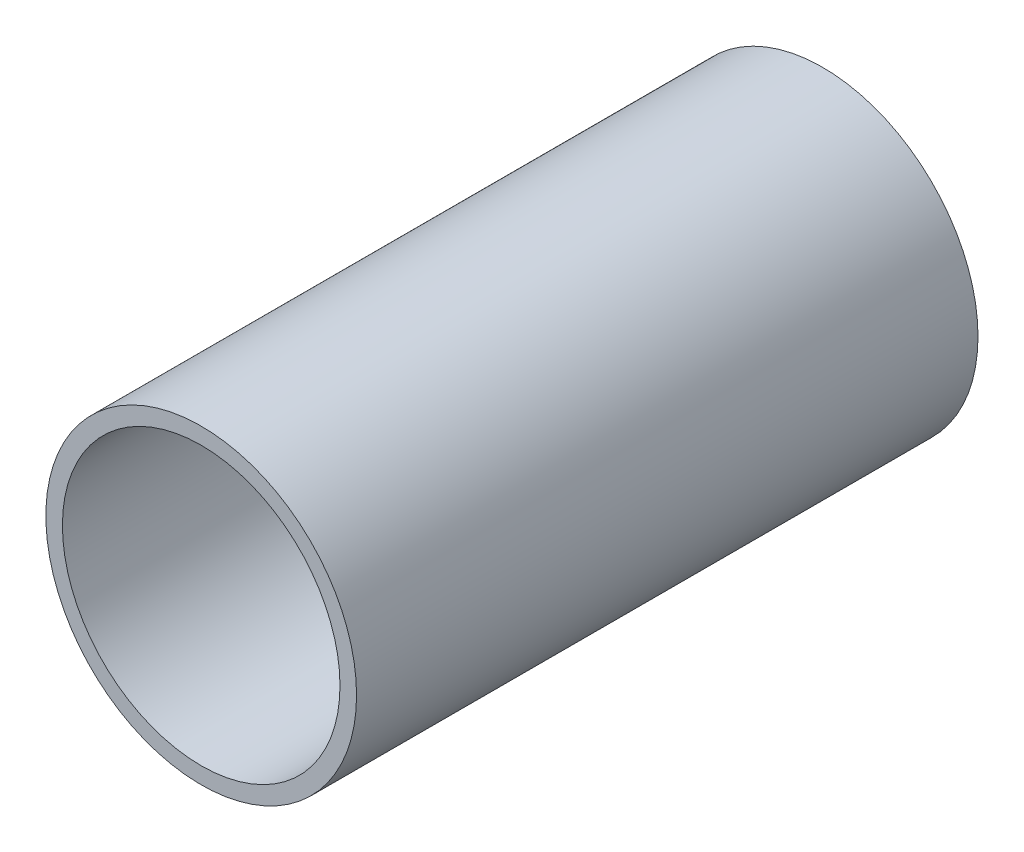
ISO-10303-21;
HEADER;
FILE_DESCRIPTION(('STEP AP214'),'2;1');
FILE_NAME('part.step','',(''),(''),'','','');
FILE_SCHEMA(('AUTOMOTIVE_DESIGN { 1 0 10303 214 1 1 1 1 }'));
ENDSEC;
DATA;
#1=APPLICATION_CONTEXT('core data for automotive mechanical design processes');
#2=APPLICATION_PROTOCOL_DEFINITION('international standard','automotive_design',2000,#1);
#3=PRODUCT_CONTEXT('',#1,'mechanical');
#4=PRODUCT('Part','Part','',(#3));
#5=PRODUCT_RELATED_PRODUCT_CATEGORY('part','',(#4));
#6=PRODUCT_DEFINITION_FORMATION('','',#4);
#7=PRODUCT_DEFINITION_CONTEXT('part definition',#1,'design');
#8=PRODUCT_DEFINITION('design','',#6,#7);
#9=PRODUCT_DEFINITION_SHAPE('','',#8);
#10=(LENGTH_UNIT() NAMED_UNIT(*) SI_UNIT(.MILLI.,.METRE.));
#11=(NAMED_UNIT(*) PLANE_ANGLE_UNIT() SI_UNIT($,.RADIAN.));
#12=(NAMED_UNIT(*) SI_UNIT($,.STERADIAN.) SOLID_ANGLE_UNIT());
#13=UNCERTAINTY_MEASURE_WITH_UNIT(LENGTH_MEASURE(1.E-05),#10,'distance_accuracy_value','');
#14=(GEOMETRIC_REPRESENTATION_CONTEXT(3) GLOBAL_UNCERTAINTY_ASSIGNED_CONTEXT((#13)) GLOBAL_UNIT_ASSIGNED_CONTEXT((#10,
#11,#12)) REPRESENTATION_CONTEXT('',''));
#15=CARTESIAN_POINT('',(0.,0.,0.));
#16=DIRECTION('',(0.,0.,1.));
#17=DIRECTION('',(1.,0.,0.));
#18=AXIS2_PLACEMENT_3D('',#15,#16,#17);
#19=CARTESIAN_POINT('',(0.,0.,60.));
#20=DIRECTION('',(0.,0.,1.));
#21=DIRECTION('',(1.,0.,0.));
#22=AXIS2_PLACEMENT_3D('',#19,#20,#21);
#23=PLANE('',#22);
#24=CARTESIAN_POINT('',(0.,0.,60.));
#25=DIRECTION('',(0.,0.,1.));
#26=DIRECTION('',(1.,0.,0.));
#27=AXIS2_PLACEMENT_3D('',#24,#25,#26);
#28=CIRCLE('',#27,15.);
#29=CARTESIAN_POINT('',(15.,0.,60.));
#30=VERTEX_POINT('',#29);
#31=EDGE_CURVE('E10',#30,#30,#28,.T.);
#32=ORIENTED_EDGE('',*,*,#31,.T.);
#33=EDGE_LOOP('',(#32));
#34=FACE_BOUND('',#33,.T.);
#35=CARTESIAN_POINT('',(0.,0.,60.));
#36=DIRECTION('',(0.,0.,1.));
#37=DIRECTION('',(1.,0.,0.));
#38=AXIS2_PLACEMENT_3D('',#35,#36,#37);
#39=CIRCLE('',#38,13.4);
#40=CARTESIAN_POINT('',(13.4,0.,60.));
#41=VERTEX_POINT('',#40);
#42=EDGE_CURVE('E50',#41,#41,#39,.T.);
#43=ORIENTED_EDGE('',*,*,#42,.F.);
#44=EDGE_LOOP('',(#43));
#45=FACE_BOUND('',#44,.T.);
#46=ADVANCED_FACE('F37',(#34,#45),#23,.T.);
#47=CARTESIAN_POINT('',(0.,0.,0.));
#48=DIRECTION('',(0.,0.,1.));
#49=DIRECTION('',(1.,0.,0.));
#50=AXIS2_PLACEMENT_3D('',#47,#48,#49);
#51=PLANE('',#50);
#52=CARTESIAN_POINT('',(0.,0.,0.));
#53=DIRECTION('',(0.,0.,1.));
#54=DIRECTION('',(1.,0.,0.));
#55=AXIS2_PLACEMENT_3D('',#52,#53,#54);
#56=CIRCLE('',#55,15.);
#57=CARTESIAN_POINT('',(15.,0.,0.));
#58=VERTEX_POINT('',#57);
#59=EDGE_CURVE('E41',#58,#58,#56,.T.);
#60=ORIENTED_EDGE('',*,*,#59,.F.);
#61=EDGE_LOOP('',(#60));
#62=FACE_BOUND('',#61,.T.);
#63=CARTESIAN_POINT('',(0.,0.,0.));
#64=DIRECTION('',(0.,0.,1.));
#65=DIRECTION('',(1.,0.,0.));
#66=AXIS2_PLACEMENT_3D('',#63,#64,#65);
#67=CIRCLE('',#66,13.4);
#68=CARTESIAN_POINT('',(13.4,0.,0.));
#69=VERTEX_POINT('',#68);
#70=EDGE_CURVE('E52',#69,#69,#67,.T.);
#71=ORIENTED_EDGE('',*,*,#70,.T.);
#72=EDGE_LOOP('',(#71));
#73=FACE_BOUND('',#72,.T.);
#74=ADVANCED_FACE('F64',(#62,#73),#51,.F.);
#75=CARTESIAN_POINT('',(0.,0.,60.));
#76=DIRECTION('',(0.,0.,-1.));
#77=DIRECTION('',(-1.,0.,0.));
#78=AXIS2_PLACEMENT_3D('',#75,#76,#77);
#79=CYLINDRICAL_SURFACE('',#78,15.);
#80=ORIENTED_EDGE('',*,*,#31,.F.);
#81=EDGE_LOOP('',(#80));
#82=FACE_BOUND('',#81,.T.);
#83=ORIENTED_EDGE('',*,*,#59,.T.);
#84=EDGE_LOOP('',(#83));
#85=FACE_BOUND('',#84,.T.);
#86=ADVANCED_FACE('F39',(#82,#85),#79,.T.);
#87=CARTESIAN_POINT('',(0.,0.,60.));
#88=DIRECTION('',(0.,0.,-1.));
#89=DIRECTION('',(-1.,0.,0.));
#90=AXIS2_PLACEMENT_3D('',#87,#88,#89);
#91=CYLINDRICAL_SURFACE('',#90,13.4);
#92=ORIENTED_EDGE('',*,*,#42,.T.);
#93=EDGE_LOOP('',(#92));
#94=FACE_BOUND('',#93,.T.);
#95=ORIENTED_EDGE('',*,*,#70,.F.);
#96=EDGE_LOOP('',(#95));
#97=FACE_BOUND('',#96,.T.);
#98=ADVANCED_FACE('F60',(#94,#97),#91,.F.);
#99=CLOSED_SHELL('',(#46,#74,#86,#98));
#100=MANIFOLD_SOLID_BREP('B2',#99);
#101=ADVANCED_BREP_SHAPE_REPRESENTATION('',(#18,#100),#14);
#102=SHAPE_DEFINITION_REPRESENTATION(#9,#101);
ENDSEC;
END-ISO-10303-21;
